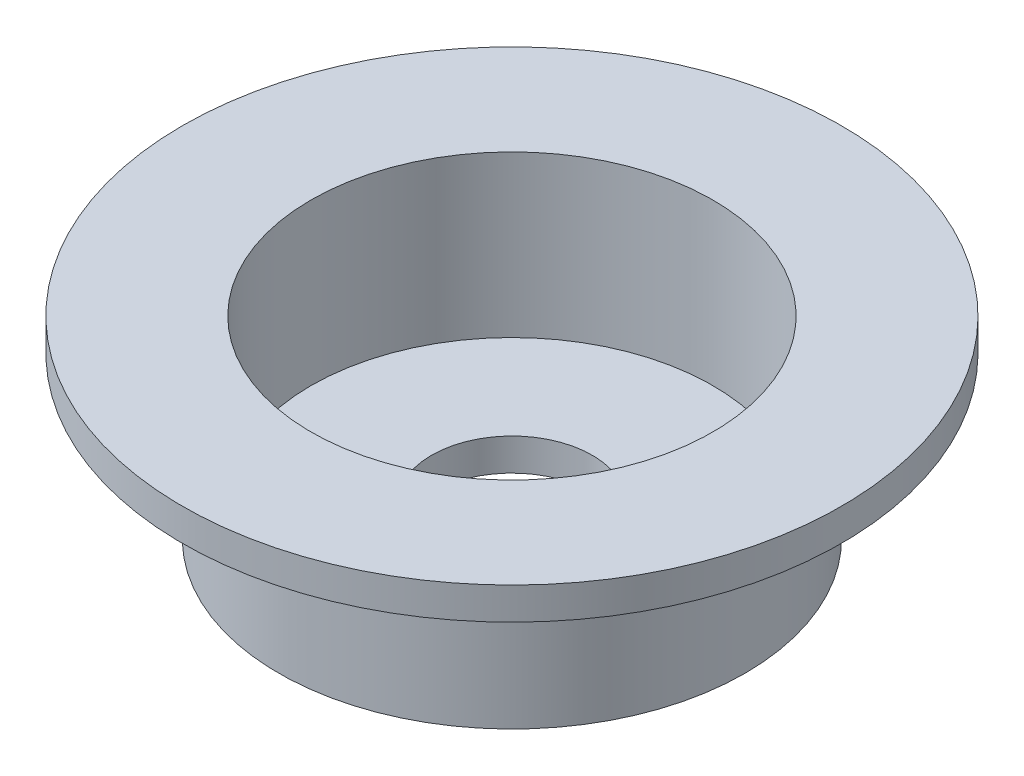
ISO-10303-21;
HEADER;
FILE_DESCRIPTION(('STEP AP214'),'2;1');
FILE_NAME('part.step','',(''),(''),'','','');
FILE_SCHEMA(('AUTOMOTIVE_DESIGN { 1 0 10303 214 1 1 1 1 }'));
ENDSEC;
DATA;
#1=APPLICATION_CONTEXT('core data for automotive mechanical design processes');
#2=APPLICATION_PROTOCOL_DEFINITION('international standard','automotive_design',2000,#1);
#3=PRODUCT_CONTEXT('',#1,'mechanical');
#4=PRODUCT('Part','Part','',(#3));
#5=PRODUCT_RELATED_PRODUCT_CATEGORY('part','',(#4));
#6=PRODUCT_DEFINITION_FORMATION('','',#4);
#7=PRODUCT_DEFINITION_CONTEXT('part definition',#1,'design');
#8=PRODUCT_DEFINITION('design','',#6,#7);
#9=PRODUCT_DEFINITION_SHAPE('','',#8);
#10=(LENGTH_UNIT() NAMED_UNIT(*) SI_UNIT(.MILLI.,.METRE.));
#11=(NAMED_UNIT(*) PLANE_ANGLE_UNIT() SI_UNIT($,.RADIAN.));
#12=(NAMED_UNIT(*) SI_UNIT($,.STERADIAN.) SOLID_ANGLE_UNIT());
#13=UNCERTAINTY_MEASURE_WITH_UNIT(LENGTH_MEASURE(1.E-05),#10,'distance_accuracy_value','');
#14=(GEOMETRIC_REPRESENTATION_CONTEXT(3) GLOBAL_UNCERTAINTY_ASSIGNED_CONTEXT((#13)) GLOBAL_UNIT_ASSIGNED_CONTEXT((#10,
#11,#12)) REPRESENTATION_CONTEXT('',''));
#15=CARTESIAN_POINT('',(0.,0.,0.));
#16=DIRECTION('',(0.,0.,1.));
#17=DIRECTION('',(1.,0.,0.));
#18=AXIS2_PLACEMENT_3D('',#15,#16,#17);
#19=CARTESIAN_POINT('',(12.5,0.,0.));
#20=DIRECTION('',(0.,1.,0.));
#21=DIRECTION('',(-1.,0.,0.));
#22=AXIS2_PLACEMENT_3D('',#19,#20,#21);
#23=CYLINDRICAL_SURFACE('',#22,12.5);
#24=CARTESIAN_POINT('',(12.5,0.,0.));
#25=DIRECTION('',(0.,1.,0.));
#26=DIRECTION('',(-1.,0.,0.));
#27=AXIS2_PLACEMENT_3D('',#24,#25,#26);
#28=CIRCLE('',#27,12.5);
#29=CARTESIAN_POINT('',(0.,0.,0.));
#30=VERTEX_POINT('',#29);
#31=EDGE_CURVE('E10',#30,#30,#28,.T.);
#32=ORIENTED_EDGE('',*,*,#31,.T.);
#33=EDGE_LOOP('',(#32));
#34=FACE_BOUND('',#33,.T.);
#35=CARTESIAN_POINT('',(12.5,-10.,0.));
#36=DIRECTION('',(0.,1.,0.));
#37=DIRECTION('',(-1.,0.,0.));
#38=AXIS2_PLACEMENT_3D('',#35,#36,#37);
#39=CIRCLE('',#38,12.5);
#40=CARTESIAN_POINT('',(0.,-10.,0.));
#41=VERTEX_POINT('',#40);
#42=EDGE_CURVE('E58',#41,#41,#39,.T.);
#43=ORIENTED_EDGE('',*,*,#42,.F.);
#44=EDGE_LOOP('',(#43));
#45=FACE_BOUND('',#44,.T.);
#46=ADVANCED_FACE('F30',(#34,#45),#23,.F.);
#47=CARTESIAN_POINT('',(0.,0.,0.));
#48=DIRECTION('',(0.,1.,0.));
#49=DIRECTION('',(-1.,0.,0.));
#50=AXIS2_PLACEMENT_3D('',#47,#48,#49);
#51=PLANE('',#50);
#52=CARTESIAN_POINT('',(12.5,0.,0.));
#53=DIRECTION('',(0.,1.,0.));
#54=DIRECTION('',(-1.,0.,0.));
#55=AXIS2_PLACEMENT_3D('',#52,#53,#54);
#56=CIRCLE('',#55,20.5);
#57=CARTESIAN_POINT('',(-8.,0.,0.));
#58=VERTEX_POINT('',#57);
#59=EDGE_CURVE('E36',#58,#58,#56,.T.);
#60=ORIENTED_EDGE('',*,*,#59,.T.);
#61=EDGE_LOOP('',(#60));
#62=FACE_BOUND('',#61,.T.);
#63=ORIENTED_EDGE('',*,*,#31,.F.);
#64=EDGE_LOOP('',(#63));
#65=FACE_BOUND('',#64,.T.);
#66=ADVANCED_FACE('F66',(#62,#65),#51,.T.);
#67=CARTESIAN_POINT('',(12.5,0.,0.));
#68=DIRECTION('',(0.,1.,0.));
#69=DIRECTION('',(-1.,0.,0.));
#70=AXIS2_PLACEMENT_3D('',#67,#68,#69);
#71=CYLINDRICAL_SURFACE('',#70,20.5);
#72=CARTESIAN_POINT('',(12.5,-2.,0.));
#73=DIRECTION('',(0.,1.,0.));
#74=DIRECTION('',(-1.,0.,0.));
#75=AXIS2_PLACEMENT_3D('',#72,#73,#74);
#76=CIRCLE('',#75,20.5);
#77=CARTESIAN_POINT('',(-8.,-2.,0.));
#78=VERTEX_POINT('',#77);
#79=EDGE_CURVE('E40',#78,#78,#76,.T.);
#80=ORIENTED_EDGE('',*,*,#79,.T.);
#81=EDGE_LOOP('',(#80));
#82=FACE_BOUND('',#81,.T.);
#83=ORIENTED_EDGE('',*,*,#59,.F.);
#84=EDGE_LOOP('',(#83));
#85=FACE_BOUND('',#84,.T.);
#86=ADVANCED_FACE('F70',(#82,#85),#71,.T.);
#87=CARTESIAN_POINT('',(12.5,-2.,0.));
#88=DIRECTION('',(0.,1.,0.));
#89=DIRECTION('',(-1.,0.,0.));
#90=AXIS2_PLACEMENT_3D('',#87,#88,#89);
#91=CONICAL_SURFACE('',#90,20.5,1.40564764938027);
#92=CARTESIAN_POINT('',(12.5,-3.,0.));
#93=DIRECTION('',(0.,1.,0.));
#94=DIRECTION('',(-1.,0.,0.));
#95=AXIS2_PLACEMENT_3D('',#92,#93,#94);
#96=CIRCLE('',#95,14.5);
#97=CARTESIAN_POINT('',(-2.,-3.,0.));
#98=VERTEX_POINT('',#97);
#99=EDGE_CURVE('E44',#98,#98,#96,.T.);
#100=ORIENTED_EDGE('',*,*,#99,.T.);
#101=EDGE_LOOP('',(#100));
#102=FACE_BOUND('',#101,.T.);
#103=ORIENTED_EDGE('',*,*,#79,.F.);
#104=EDGE_LOOP('',(#103));
#105=FACE_BOUND('',#104,.T.);
#106=ADVANCED_FACE('F74',(#102,#105),#91,.T.);
#107=CARTESIAN_POINT('',(12.5,0.,0.));
#108=DIRECTION('',(0.,1.,0.));
#109=DIRECTION('',(-1.,0.,0.));
#110=AXIS2_PLACEMENT_3D('',#107,#108,#109);
#111=CYLINDRICAL_SURFACE('',#110,14.5);
#112=CARTESIAN_POINT('',(12.5,-12.,0.));
#113=DIRECTION('',(0.,1.,0.));
#114=DIRECTION('',(-1.,0.,0.));
#115=AXIS2_PLACEMENT_3D('',#112,#113,#114);
#116=CIRCLE('',#115,14.5);
#117=CARTESIAN_POINT('',(-2.,-12.,0.));
#118=VERTEX_POINT('',#117);
#119=EDGE_CURVE('E49',#118,#118,#116,.T.);
#120=ORIENTED_EDGE('',*,*,#119,.T.);
#121=EDGE_LOOP('',(#120));
#122=FACE_BOUND('',#121,.T.);
#123=ORIENTED_EDGE('',*,*,#99,.F.);
#124=EDGE_LOOP('',(#123));
#125=FACE_BOUND('',#124,.T.);
#126=ADVANCED_FACE('F81',(#122,#125),#111,.T.);
#127=CARTESIAN_POINT('',(-2.,-12.,0.));
#128=DIRECTION('',(0.,-1.,0.));
#129=DIRECTION('',(1.,0.,0.));
#130=AXIS2_PLACEMENT_3D('',#127,#128,#129);
#131=PLANE('',#130);
#132=CARTESIAN_POINT('',(12.5,-12.,0.));
#133=DIRECTION('',(0.,1.,0.));
#134=DIRECTION('',(-1.,0.,0.));
#135=AXIS2_PLACEMENT_3D('',#132,#133,#134);
#136=CIRCLE('',#135,5.);
#137=CARTESIAN_POINT('',(7.5,-12.,0.));
#138=VERTEX_POINT('',#137);
#139=EDGE_CURVE('E52',#138,#138,#136,.T.);
#140=ORIENTED_EDGE('',*,*,#139,.T.);
#141=EDGE_LOOP('',(#140));
#142=FACE_BOUND('',#141,.T.);
#143=ORIENTED_EDGE('',*,*,#119,.F.);
#144=EDGE_LOOP('',(#143));
#145=FACE_BOUND('',#144,.T.);
#146=ADVANCED_FACE('F85',(#142,#145),#131,.T.);
#147=CARTESIAN_POINT('',(12.5,0.,0.));
#148=DIRECTION('',(0.,1.,0.));
#149=DIRECTION('',(-1.,0.,0.));
#150=AXIS2_PLACEMENT_3D('',#147,#148,#149);
#151=CYLINDRICAL_SURFACE('',#150,5.);
#152=CARTESIAN_POINT('',(12.5,-10.,0.));
#153=DIRECTION('',(0.,1.,0.));
#154=DIRECTION('',(-1.,0.,0.));
#155=AXIS2_PLACEMENT_3D('',#152,#153,#154);
#156=CIRCLE('',#155,5.);
#157=CARTESIAN_POINT('',(7.5,-10.,0.));
#158=VERTEX_POINT('',#157);
#159=EDGE_CURVE('E55',#158,#158,#156,.T.);
#160=ORIENTED_EDGE('',*,*,#159,.T.);
#161=EDGE_LOOP('',(#160));
#162=FACE_BOUND('',#161,.T.);
#163=ORIENTED_EDGE('',*,*,#139,.F.);
#164=EDGE_LOOP('',(#163));
#165=FACE_BOUND('',#164,.T.);
#166=ADVANCED_FACE('F89',(#162,#165),#151,.F.);
#167=CARTESIAN_POINT('',(7.5,-10.,0.));
#168=DIRECTION('',(0.,1.,0.));
#169=DIRECTION('',(-1.,0.,0.));
#170=AXIS2_PLACEMENT_3D('',#167,#168,#169);
#171=PLANE('',#170);
#172=ORIENTED_EDGE('',*,*,#42,.T.);
#173=EDGE_LOOP('',(#172));
#174=FACE_BOUND('',#173,.T.);
#175=ORIENTED_EDGE('',*,*,#159,.F.);
#176=EDGE_LOOP('',(#175));
#177=FACE_BOUND('',#176,.T.);
#178=ADVANCED_FACE('F62',(#174,#177),#171,.T.);
#179=CLOSED_SHELL('',(#46,#66,#86,#106,#126,#146,#166,#178));
#180=MANIFOLD_SOLID_BREP('B2',#179);
#181=ADVANCED_BREP_SHAPE_REPRESENTATION('',(#18,#180),#14);
#182=SHAPE_DEFINITION_REPRESENTATION(#9,#181);
ENDSEC;
END-ISO-10303-21;
